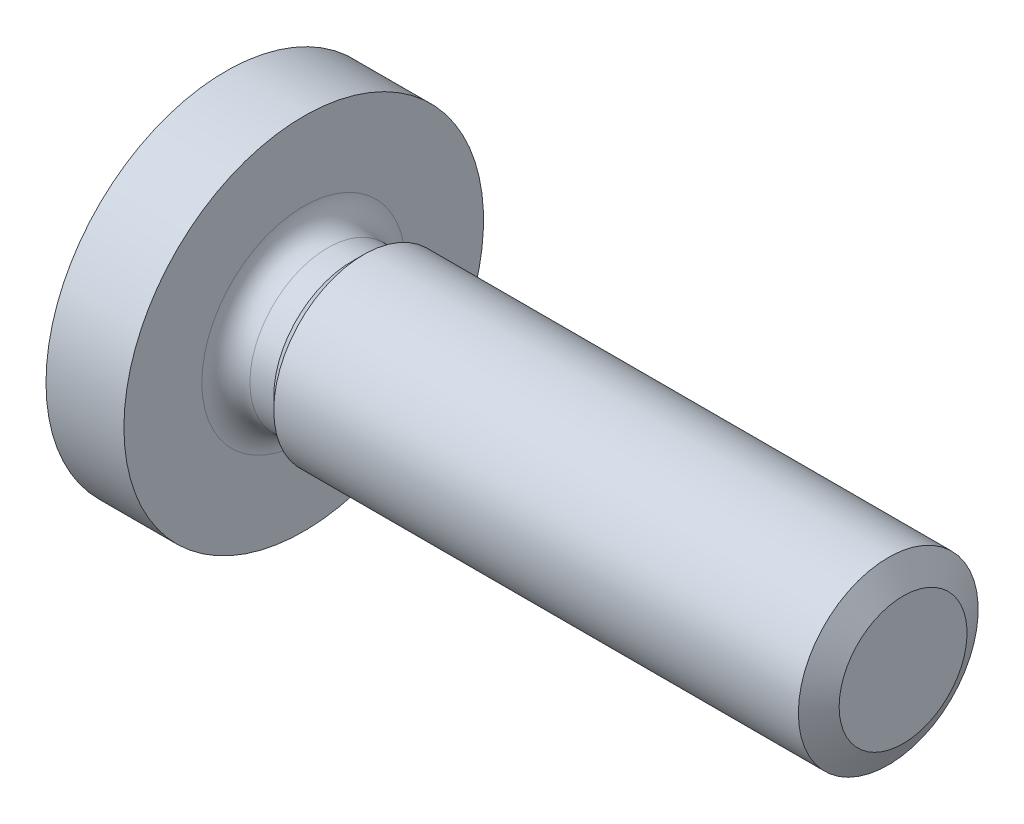
ISO-10303-21;
HEADER;
FILE_DESCRIPTION(('STEP AP214'),'2;1');
FILE_NAME('part.step','',(''),(''),'','','');
FILE_SCHEMA(('AUTOMOTIVE_DESIGN { 1 0 10303 214 1 1 1 1 }'));
ENDSEC;
DATA;
#1=APPLICATION_CONTEXT('core data for automotive mechanical design processes');
#2=APPLICATION_PROTOCOL_DEFINITION('international standard','automotive_design',2000,#1);
#3=PRODUCT_CONTEXT('',#1,'mechanical');
#4=PRODUCT('Part','Part','',(#3));
#5=PRODUCT_RELATED_PRODUCT_CATEGORY('part','',(#4));
#6=PRODUCT_DEFINITION_FORMATION('','',#4);
#7=PRODUCT_DEFINITION_CONTEXT('part definition',#1,'design');
#8=PRODUCT_DEFINITION('design','',#6,#7);
#9=PRODUCT_DEFINITION_SHAPE('','',#8);
#10=(LENGTH_UNIT() NAMED_UNIT(*) SI_UNIT(.MILLI.,.METRE.));
#11=(NAMED_UNIT(*) PLANE_ANGLE_UNIT() SI_UNIT($,.RADIAN.));
#12=(NAMED_UNIT(*) SI_UNIT($,.STERADIAN.) SOLID_ANGLE_UNIT());
#13=UNCERTAINTY_MEASURE_WITH_UNIT(LENGTH_MEASURE(1.E-05),#10,'distance_accuracy_value','');
#14=(GEOMETRIC_REPRESENTATION_CONTEXT(3) GLOBAL_UNCERTAINTY_ASSIGNED_CONTEXT((#13)) GLOBAL_UNIT_ASSIGNED_CONTEXT((#10,
#11,#12)) REPRESENTATION_CONTEXT('',''));
#15=CARTESIAN_POINT('',(0.,0.,0.));
#16=DIRECTION('',(0.,0.,1.));
#17=DIRECTION('',(1.,0.,0.));
#18=AXIS2_PLACEMENT_3D('',#15,#16,#17);
#19=CARTESIAN_POINT('',(3.6,0.,0.));
#20=DIRECTION('',(0.137568371274688,0.,-0.990492273177751));
#21=DIRECTION('',(-0.990492273177752,0.,-0.137568371274688));
#22=AXIS2_PLACEMENT_3D('',#19,#20,#21);
#23=PLANE('',#22);
#24=DIRECTION('',(-0.71838544707728,-0.688452720115727,-0.0997757565385112));
#25=VECTOR('',#24,1.);
#26=CARTESIAN_POINT('',(3.6,0.,0.));
#27=LINE('',#26,#25);
#28=CARTESIAN_POINT('',(3.6,0.,0.));
#29=VERTEX_POINT('',#28);
#30=CARTESIAN_POINT('',(0.470296179970065,-2.99929949419535,-0.434681086115269));
#31=VERTEX_POINT('',#30);
#32=EDGE_CURVE('E156',#29,#31,#27,.T.);
#33=ORIENTED_EDGE('',*,*,#32,.F.);
#34=DIRECTION('',(-0.981250680241291,-0.136284816700179,-0.136284816700179));
#35=VECTOR('',#34,1.);
#36=CARTESIAN_POINT('',(3.6,0.,0.));
#37=LINE('',#36,#35);
#38=CARTESIAN_POINT('',(0.0246887531766358,-0.496571006503243,-0.496571006503246));
#39=VERTEX_POINT('',#38);
#40=EDGE_CURVE('E117',#29,#39,#37,.T.);
#41=ORIENTED_EDGE('',*,*,#40,.T.);
#42=CARTESIAN_POINT('',(9.87887963663891,0.,0.872066616199849));
#43=DIRECTION('',(0.137568371274688,0.,-0.990492273177751));
#44=DIRECTION('',(-0.990492273177752,0.,-0.137568371274688));
#45=AXIS2_PLACEMENT_3D('',#42,#43,#44);
#46=CIRCLE('',#45,9.96116608005755);
#47=EDGE_CURVE('E130',#31,#39,#46,.T.);
#48=ORIENTED_EDGE('',*,*,#47,.F.);
#49=EDGE_LOOP('',(#33,#41,#48));
#50=FACE_BOUND('',#49,.T.);
#51=ADVANCED_FACE('F37',(#50),#23,.F.);
#52=CARTESIAN_POINT('',(3.6,0.,0.));
#53=DIRECTION('',(0.137568371274688,0.,0.990492273177751));
#54=DIRECTION('',(0.990492273177752,0.,-0.137568371274688));
#55=AXIS2_PLACEMENT_3D('',#52,#53,#54);
#56=PLANE('',#55);
#57=CARTESIAN_POINT('',(9.87887963663891,0.,-0.872066616199848));
#58=DIRECTION('',(0.137568371274688,0.,0.990492273177751));
#59=DIRECTION('',(0.990492273177752,0.,-0.137568371274688));
#60=AXIS2_PLACEMENT_3D('',#57,#58,#59);
#61=CIRCLE('',#60,9.96116608005755);
#62=CARTESIAN_POINT('',(0.0246887531766358,-0.496571006503248,0.496571006503245));
#63=VERTEX_POINT('',#62);
#64=CARTESIAN_POINT('',(0.470296179970068,-2.99929949419536,0.434681086115269));
#65=VERTEX_POINT('',#64);
#66=EDGE_CURVE('E60',#63,#65,#61,.T.);
#67=ORIENTED_EDGE('',*,*,#66,.F.);
#68=DIRECTION('',(0.981250680241291,0.13628481670018,-0.136284816700179));
#69=VECTOR('',#68,1.);
#70=CARTESIAN_POINT('',(3.6,0.,0.));
#71=LINE('',#70,#69);
#72=EDGE_CURVE('E11',#63,#29,#71,.T.);
#73=ORIENTED_EDGE('',*,*,#72,.T.);
#74=DIRECTION('',(-0.71838544707728,-0.688452720115727,0.0997757565385112));
#75=VECTOR('',#74,1.);
#76=CARTESIAN_POINT('',(3.6,0.,0.));
#77=LINE('',#76,#75);
#78=EDGE_CURVE('E157',#29,#65,#77,.T.);
#79=ORIENTED_EDGE('',*,*,#78,.T.);
#80=EDGE_LOOP('',(#67,#73,#79));
#81=FACE_BOUND('',#80,.T.);
#82=ADVANCED_FACE('F172',(#81),#56,.F.);
#83=CARTESIAN_POINT('',(-1.33175770411172,0.,0.));
#84=DIRECTION('',(-1.,0.,0.));
#85=DIRECTION('',(0.,0.,1.));
#86=AXIS2_PLACEMENT_3D('',#83,#84,#85);
#87=CYLINDRICAL_SURFACE('',#86,3.);
#88=CARTESIAN_POINT('',(6.6,0.,0.));
#89=DIRECTION('',(-1.,0.,0.));
#90=DIRECTION('',(0.,0.,1.));
#91=AXIS2_PLACEMENT_3D('',#88,#89,#90);
#92=CIRCLE('',#91,3.);
#93=CARTESIAN_POINT('',(6.6,0.,3.));
#94=VERTEX_POINT('',#93);
#95=EDGE_CURVE('E193',#94,#94,#92,.T.);
#96=ORIENTED_EDGE('',*,*,#95,.F.);
#97=EDGE_LOOP('',(#96));
#98=FACE_BOUND('',#97,.T.);
#99=CARTESIAN_POINT('',(24.1054160057443,0.,0.));
#100=DIRECTION('',(-1.,0.,0.));
#101=DIRECTION('',(0.,0.,1.));
#102=AXIS2_PLACEMENT_3D('',#99,#100,#101);
#103=CIRCLE('',#102,3.);
#104=CARTESIAN_POINT('',(24.1054160057443,0.,3.));
#105=VERTEX_POINT('',#104);
#106=EDGE_CURVE('E190',#105,#105,#103,.T.);
#107=ORIENTED_EDGE('',*,*,#106,.T.);
#108=EDGE_LOOP('',(#107));
#109=FACE_BOUND('',#108,.T.);
#110=ADVANCED_FACE('F237',(#98,#109),#87,.T.);
#111=CARTESIAN_POINT('',(10.,0.,0.));
#112=DIRECTION('',(-1.,0.,0.));
#113=DIRECTION('',(0.,1.,0.));
#114=AXIS2_PLACEMENT_3D('',#111,#112,#113);
#115=SPHERICAL_SURFACE('',#114,10.);
#116=CARTESIAN_POINT('',(6.93610859728507,0.,-3.19710407239819));
#117=DIRECTION('',(0.691905363235615,0.,0.721988205115424));
#118=DIRECTION('',(0.721988205115424,0.,-0.691905363235615));
#119=AXIS2_PLACEMENT_3D('',#116,#117,#118);
#120=CIRCLE('',#119,8.96610813132568);
#121=CARTESIAN_POINT('',(0.470296179970068,0.434681086115258,2.99929949419536));
#122=VERTEX_POINT('',#121);
#123=CARTESIAN_POINT('',(0.470296179970064,-0.434681086115279,2.99929949419535));
#124=VERTEX_POINT('',#123);
#125=EDGE_CURVE('E123',#122,#124,#120,.T.);
#126=ORIENTED_EDGE('',*,*,#125,.T.);
#127=CARTESIAN_POINT('',(9.87887963663891,0.872066616199849,0.));
#128=DIRECTION('',(0.137568371274688,-0.990492273177751,0.));
#129=DIRECTION('',(0.990492273177752,0.137568371274688,0.));
#130=AXIS2_PLACEMENT_3D('',#127,#128,#129);
#131=CIRCLE('',#130,9.96116608005755);
#132=EDGE_CURVE('E139',#124,#63,#131,.T.);
#133=ORIENTED_EDGE('',*,*,#132,.T.);
#134=ORIENTED_EDGE('',*,*,#66,.T.);
#135=CARTESIAN_POINT('',(6.93610859728507,3.19710407239819,0.));
#136=DIRECTION('',(0.691905363235615,-0.721988205115424,0.));
#137=DIRECTION('',(0.721988205115424,0.691905363235615,0.));
#138=AXIS2_PLACEMENT_3D('',#135,#136,#137);
#139=CIRCLE('',#138,8.96610813132568);
#140=EDGE_CURVE('E169',#65,#31,#139,.T.);
#141=ORIENTED_EDGE('',*,*,#140,.T.);
#142=ORIENTED_EDGE('',*,*,#47,.T.);
#143=CARTESIAN_POINT('',(0.470296179970064,-0.434681086115258,-2.99929949419535));
#144=VERTEX_POINT('',#143);
#145=EDGE_CURVE('E119',#39,#144,#131,.T.);
#146=ORIENTED_EDGE('',*,*,#145,.T.);
#147=CARTESIAN_POINT('',(6.93610859728507,0.,3.19710407239819));
#148=DIRECTION('',(0.691905363235615,0.,-0.721988205115424));
#149=DIRECTION('',(-0.721988205115424,0.,-0.691905363235615));
#150=AXIS2_PLACEMENT_3D('',#147,#148,#149);
#151=CIRCLE('',#150,8.96610813132568);
#152=CARTESIAN_POINT('',(0.470296179970066,0.434681086115279,-2.99929949419535));
#153=VERTEX_POINT('',#152);
#154=EDGE_CURVE('E111',#144,#153,#151,.T.);
#155=ORIENTED_EDGE('',*,*,#154,.T.);
#156=CARTESIAN_POINT('',(9.87887963663891,-0.872066616199848,0.));
#157=DIRECTION('',(0.137568371274688,0.990492273177751,0.));
#158=DIRECTION('',(-0.990492273177752,0.137568371274688,0.));
#159=AXIS2_PLACEMENT_3D('',#156,#157,#158);
#160=CIRCLE('',#159,9.96116608005755);
#161=CARTESIAN_POINT('',(0.024688753176634,0.496571006503247,-0.496571006503246));
#162=VERTEX_POINT('',#161);
#163=EDGE_CURVE('E102',#153,#162,#160,.T.);
#164=ORIENTED_EDGE('',*,*,#163,.T.);
#165=CARTESIAN_POINT('',(0.470296179970065,2.99929949419535,-0.434681086115269));
#166=VERTEX_POINT('',#165);
#167=EDGE_CURVE('E147',#162,#166,#46,.T.);
#168=ORIENTED_EDGE('',*,*,#167,.T.);
#169=CARTESIAN_POINT('',(6.93610859728507,-3.19710407239819,0.));
#170=DIRECTION('',(0.691905363235615,0.721988205115424,0.));
#171=DIRECTION('',(-0.721988205115424,0.691905363235615,0.));
#172=AXIS2_PLACEMENT_3D('',#169,#170,#171);
#173=CIRCLE('',#172,8.96610813132568);
#174=CARTESIAN_POINT('',(0.470296179970068,2.99929949419536,0.434681086115269));
#175=VERTEX_POINT('',#174);
#176=EDGE_CURVE('E160',#166,#175,#173,.T.);
#177=ORIENTED_EDGE('',*,*,#176,.T.);
#178=CARTESIAN_POINT('',(0.0246887531766358,0.496571006503243,0.496571006503246));
#179=VERTEX_POINT('',#178);
#180=EDGE_CURVE('E152',#175,#179,#61,.T.);
#181=ORIENTED_EDGE('',*,*,#180,.T.);
#182=EDGE_CURVE('E52',#179,#122,#160,.T.);
#183=ORIENTED_EDGE('',*,*,#182,.T.);
#184=EDGE_LOOP('',(#126,#133,#134,#141,#142,#146,#155,#164,#168,#177,#181,#183));
#185=FACE_BOUND('',#184,.T.);
#186=CARTESIAN_POINT('',(2.,0.,0.));
#187=DIRECTION('',(-1.,0.,0.));
#188=DIRECTION('',(0.,0.,1.));
#189=AXIS2_PLACEMENT_3D('',#186,#187,#188);
#190=CIRCLE('',#189,6.);
#191=CARTESIAN_POINT('',(2.,0.,6.));
#192=VERTEX_POINT('',#191);
#193=EDGE_CURVE('E173',#192,#192,#190,.T.);
#194=ORIENTED_EDGE('',*,*,#193,.T.);
#195=EDGE_LOOP('',(#194));
#196=FACE_BOUND('',#195,.T.);
#197=ADVANCED_FACE('F39',(#185,#196),#115,.T.);
#198=CARTESIAN_POINT('',(-1.33175770411172,0.,0.));
#199=DIRECTION('',(-1.,0.,0.));
#200=DIRECTION('',(0.,0.,1.));
#201=AXIS2_PLACEMENT_3D('',#198,#199,#200);
#202=CYLINDRICAL_SURFACE('',#201,6.);
#203=ORIENTED_EDGE('',*,*,#193,.F.);
#204=EDGE_LOOP('',(#203));
#205=FACE_BOUND('',#204,.T.);
#206=CARTESIAN_POINT('',(4.6,0.,0.));
#207=DIRECTION('',(-1.,0.,0.));
#208=DIRECTION('',(0.,0.,1.));
#209=AXIS2_PLACEMENT_3D('',#206,#207,#208);
#210=CIRCLE('',#209,6.);
#211=CARTESIAN_POINT('',(4.6,0.,6.));
#212=VERTEX_POINT('',#211);
#213=EDGE_CURVE('E176',#212,#212,#210,.T.);
#214=ORIENTED_EDGE('',*,*,#213,.T.);
#215=EDGE_LOOP('',(#214));
#216=FACE_BOUND('',#215,.T.);
#217=ADVANCED_FACE('F210',(#205,#216),#202,.T.);
#218=CARTESIAN_POINT('',(4.6,3.4,0.));
#219=DIRECTION('',(-1.,0.,0.));
#220=DIRECTION('',(0.,0.,1.));
#221=AXIS2_PLACEMENT_3D('',#218,#219,#220);
#222=PLANE('',#221);
#223=ORIENTED_EDGE('',*,*,#213,.F.);
#224=EDGE_LOOP('',(#223));
#225=FACE_BOUND('',#224,.T.);
#226=CARTESIAN_POINT('',(4.6,0.,0.));
#227=DIRECTION('',(-1.,0.,0.));
#228=DIRECTION('',(0.,0.,1.));
#229=AXIS2_PLACEMENT_3D('',#226,#227,#228);
#230=CIRCLE('',#229,3.4);
#231=CARTESIAN_POINT('',(4.6,0.,3.4));
#232=VERTEX_POINT('',#231);
#233=EDGE_CURVE('E202',#232,#232,#230,.T.);
#234=ORIENTED_EDGE('',*,*,#233,.T.);
#235=EDGE_LOOP('',(#234));
#236=FACE_BOUND('',#235,.T.);
#237=ADVANCED_FACE('F212',(#225,#236),#222,.F.);
#238=CARTESIAN_POINT('',(5.402,0.,0.));
#239=DIRECTION('',(-1.,0.,0.));
#240=DIRECTION('',(0.,0.,1.));
#241=AXIS2_PLACEMENT_3D('',#238,#239,#240);
#242=TOROIDAL_SURFACE('',#241,3.4,0.801999999999999);
#243=ORIENTED_EDGE('',*,*,#233,.F.);
#244=EDGE_LOOP('',(#243));
#245=FACE_BOUND('',#244,.T.);
#246=CARTESIAN_POINT('',(5.402,0.,0.));
#247=DIRECTION('',(-1.,0.,0.));
#248=DIRECTION('',(0.,0.,1.));
#249=AXIS2_PLACEMENT_3D('',#246,#247,#248);
#250=CIRCLE('',#249,2.598);
#251=CARTESIAN_POINT('',(5.402,0.,2.598));
#252=VERTEX_POINT('',#251);
#253=EDGE_CURVE('E199',#252,#252,#250,.T.);
#254=ORIENTED_EDGE('',*,*,#253,.T.);
#255=EDGE_LOOP('',(#254));
#256=FACE_BOUND('',#255,.T.);
#257=ADVANCED_FACE('F215',(#245,#256),#242,.F.);
#258=CARTESIAN_POINT('',(-1.33175770411172,0.,0.));
#259=DIRECTION('',(-1.,0.,0.));
#260=DIRECTION('',(0.,0.,1.));
#261=AXIS2_PLACEMENT_3D('',#258,#259,#260);
#262=CYLINDRICAL_SURFACE('',#261,2.598);
#263=ORIENTED_EDGE('',*,*,#253,.F.);
#264=EDGE_LOOP('',(#263));
#265=FACE_BOUND('',#264,.T.);
#266=CARTESIAN_POINT('',(6.198,0.,0.));
#267=DIRECTION('',(-1.,0.,0.));
#268=DIRECTION('',(0.,0.,1.));
#269=AXIS2_PLACEMENT_3D('',#266,#267,#268);
#270=CIRCLE('',#269,2.598);
#271=CARTESIAN_POINT('',(6.198,0.,2.598));
#272=VERTEX_POINT('',#271);
#273=EDGE_CURVE('E196',#272,#272,#270,.T.);
#274=ORIENTED_EDGE('',*,*,#273,.T.);
#275=EDGE_LOOP('',(#274));
#276=FACE_BOUND('',#275,.T.);
#277=ADVANCED_FACE('F221',(#265,#276),#262,.T.);
#278=CARTESIAN_POINT('',(6.6,0.,0.));
#279=DIRECTION('',(1.,0.,0.));
#280=DIRECTION('',(0.,0.,-1.));
#281=AXIS2_PLACEMENT_3D('',#278,#279,#280);
#282=CONICAL_SURFACE('',#281,3.,0.785398163397445);
#283=ORIENTED_EDGE('',*,*,#273,.F.);
#284=EDGE_LOOP('',(#283));
#285=FACE_BOUND('',#284,.T.);
#286=ORIENTED_EDGE('',*,*,#95,.T.);
#287=EDGE_LOOP('',(#286));
#288=FACE_BOUND('',#287,.T.);
#289=ADVANCED_FACE('F227',(#285,#288),#282,.T.);
#290=CARTESIAN_POINT('',(24.1054160057443,0.,0.));
#291=DIRECTION('',(-1.,0.,0.));
#292=DIRECTION('',(0.,0.,1.));
#293=AXIS2_PLACEMENT_3D('',#290,#291,#292);
#294=CONICAL_SURFACE('',#293,3.,1.05188801855298);
#295=CARTESIAN_POINT('',(24.6,0.,0.));
#296=DIRECTION('',(-1.,0.,0.));
#297=DIRECTION('',(0.,0.,1.));
#298=AXIS2_PLACEMENT_3D('',#295,#296,#297);
#299=CIRCLE('',#298,2.134);
#300=CARTESIAN_POINT('',(24.6,0.,2.134));
#301=VERTEX_POINT('',#300);
#302=EDGE_CURVE('E161',#301,#301,#299,.T.);
#303=ORIENTED_EDGE('',*,*,#302,.T.);
#304=EDGE_LOOP('',(#303));
#305=FACE_BOUND('',#304,.T.);
#306=ORIENTED_EDGE('',*,*,#106,.F.);
#307=EDGE_LOOP('',(#306));
#308=FACE_BOUND('',#307,.T.);
#309=ADVANCED_FACE('F233',(#305,#308),#294,.T.);
#310=CARTESIAN_POINT('',(24.6,0.,0.));
#311=DIRECTION('',(-1.,0.,0.));
#312=DIRECTION('',(0.,0.,1.));
#313=AXIS2_PLACEMENT_3D('',#310,#311,#312);
#314=PLANE('',#313);
#315=ORIENTED_EDGE('',*,*,#302,.F.);
#316=EDGE_LOOP('',(#315));
#317=FACE_BOUND('',#316,.T.);
#318=ADVANCED_FACE('F244',(#317),#314,.F.);
#319=ORIENTED_EDGE('',*,*,#167,.F.);
#320=DIRECTION('',(0.981250680241291,-0.13628481670018,0.136284816700179));
#321=VECTOR('',#320,1.);
#322=CARTESIAN_POINT('',(3.6,0.,0.));
#323=LINE('',#322,#321);
#324=EDGE_CURVE('E100',#162,#29,#323,.T.);
#325=ORIENTED_EDGE('',*,*,#324,.T.);
#326=DIRECTION('',(-0.71838544707728,0.688452720115727,-0.0997757565385112));
#327=VECTOR('',#326,1.);
#328=CARTESIAN_POINT('',(3.6,0.,0.));
#329=LINE('',#328,#327);
#330=EDGE_CURVE('E146',#29,#166,#329,.T.);
#331=ORIENTED_EDGE('',*,*,#330,.T.);
#332=EDGE_LOOP('',(#319,#325,#331));
#333=FACE_BOUND('',#332,.T.);
#334=ADVANCED_FACE('F144',(#333),#23,.F.);
#335=CARTESIAN_POINT('',(0.,3.45,-0.5));
#336=DIRECTION('',(0.691905363235615,0.721988205115424,0.));
#337=DIRECTION('',(-0.721988205115424,0.691905363235615,0.));
#338=AXIS2_PLACEMENT_3D('',#335,#336,#337);
#339=PLANE('',#338);
#340=ORIENTED_EDGE('',*,*,#330,.F.);
#341=DIRECTION('',(-0.71838544707728,0.688452720115727,0.0997757565385111));
#342=VECTOR('',#341,1.);
#343=CARTESIAN_POINT('',(3.6,0.,0.));
#344=LINE('',#343,#342);
#345=EDGE_CURVE('E150',#29,#175,#344,.T.);
#346=ORIENTED_EDGE('',*,*,#345,.T.);
#347=ORIENTED_EDGE('',*,*,#176,.F.);
#348=EDGE_LOOP('',(#340,#346,#347));
#349=FACE_BOUND('',#348,.T.);
#350=ADVANCED_FACE('F159',(#349),#339,.F.);
#351=CARTESIAN_POINT('',(0.,-3.45,0.5));
#352=DIRECTION('',(0.691905363235615,-0.721988205115424,0.));
#353=DIRECTION('',(0.721988205115424,0.691905363235615,0.));
#354=AXIS2_PLACEMENT_3D('',#351,#352,#353);
#355=PLANE('',#354);
#356=ORIENTED_EDGE('',*,*,#78,.F.);
#357=ORIENTED_EDGE('',*,*,#32,.T.);
#358=ORIENTED_EDGE('',*,*,#140,.F.);
#359=EDGE_LOOP('',(#356,#357,#358));
#360=FACE_BOUND('',#359,.T.);
#361=ADVANCED_FACE('F168',(#360),#355,.F.);
#362=ORIENTED_EDGE('',*,*,#345,.F.);
#363=DIRECTION('',(-0.981250680241291,0.136284816700179,0.136284816700179));
#364=VECTOR('',#363,1.);
#365=CARTESIAN_POINT('',(3.6,0.,0.));
#366=LINE('',#365,#364);
#367=EDGE_CURVE('E45',#29,#179,#366,.T.);
#368=ORIENTED_EDGE('',*,*,#367,.T.);
#369=ORIENTED_EDGE('',*,*,#180,.F.);
#370=EDGE_LOOP('',(#362,#368,#369));
#371=FACE_BOUND('',#370,.T.);
#372=ADVANCED_FACE('F151',(#371),#56,.F.);
#373=CARTESIAN_POINT('',(3.6,0.,0.));
#374=DIRECTION('',(0.137568371274688,-0.990492273177751,0.));
#375=DIRECTION('',(-0.990492273177752,-0.137568371274688,0.));
#376=AXIS2_PLACEMENT_3D('',#373,#374,#375);
#377=PLANE('',#376);
#378=DIRECTION('',(-0.71838544707728,-0.0997757565385136,0.688452720115727));
#379=VECTOR('',#378,1.);
#380=CARTESIAN_POINT('',(3.6,0.,0.));
#381=LINE('',#380,#379);
#382=EDGE_CURVE('E114',#29,#124,#381,.T.);
#383=ORIENTED_EDGE('',*,*,#382,.F.);
#384=ORIENTED_EDGE('',*,*,#72,.F.);
#385=ORIENTED_EDGE('',*,*,#132,.F.);
#386=EDGE_LOOP('',(#383,#384,#385));
#387=FACE_BOUND('',#386,.T.);
#388=ADVANCED_FACE('F138',(#387),#377,.F.);
#389=CARTESIAN_POINT('',(3.6,0.,0.));
#390=DIRECTION('',(0.137568371274688,0.990492273177751,0.));
#391=DIRECTION('',(0.990492273177752,-0.137568371274688,0.));
#392=AXIS2_PLACEMENT_3D('',#389,#390,#391);
#393=PLANE('',#392);
#394=ORIENTED_EDGE('',*,*,#367,.F.);
#395=DIRECTION('',(-0.71838544707728,0.0997757565385087,0.688452720115727));
#396=VECTOR('',#395,1.);
#397=CARTESIAN_POINT('',(3.6,0.,0.));
#398=LINE('',#397,#396);
#399=EDGE_CURVE('E105',#29,#122,#398,.T.);
#400=ORIENTED_EDGE('',*,*,#399,.T.);
#401=ORIENTED_EDGE('',*,*,#182,.F.);
#402=EDGE_LOOP('',(#394,#400,#401));
#403=FACE_BOUND('',#402,.T.);
#404=ADVANCED_FACE('F126',(#403),#393,.F.);
#405=CARTESIAN_POINT('',(0.,-0.500000000000012,3.45));
#406=DIRECTION('',(0.691905363235615,0.,0.721988205115424));
#407=DIRECTION('',(-0.721988205115424,0.,0.691905363235615));
#408=AXIS2_PLACEMENT_3D('',#405,#406,#407);
#409=PLANE('',#408);
#410=ORIENTED_EDGE('',*,*,#399,.F.);
#411=ORIENTED_EDGE('',*,*,#382,.T.);
#412=ORIENTED_EDGE('',*,*,#125,.F.);
#413=EDGE_LOOP('',(#410,#411,#412));
#414=FACE_BOUND('',#413,.T.);
#415=ADVANCED_FACE('F134',(#414),#409,.F.);
#416=ORIENTED_EDGE('',*,*,#40,.F.);
#417=DIRECTION('',(-0.71838544707728,-0.0997757565385088,-0.688452720115727));
#418=VECTOR('',#417,1.);
#419=CARTESIAN_POINT('',(3.6,0.,0.));
#420=LINE('',#419,#418);
#421=EDGE_CURVE('E108',#29,#144,#420,.T.);
#422=ORIENTED_EDGE('',*,*,#421,.T.);
#423=ORIENTED_EDGE('',*,*,#145,.F.);
#424=EDGE_LOOP('',(#416,#422,#423));
#425=FACE_BOUND('',#424,.T.);
#426=ADVANCED_FACE('F118',(#425),#377,.F.);
#427=CARTESIAN_POINT('',(0.,0.500000000000012,-3.45));
#428=DIRECTION('',(0.691905363235615,0.,-0.721988205115424));
#429=DIRECTION('',(0.721988205115424,0.,0.691905363235615));
#430=AXIS2_PLACEMENT_3D('',#427,#428,#429);
#431=PLANE('',#430);
#432=ORIENTED_EDGE('',*,*,#421,.F.);
#433=DIRECTION('',(-0.71838544707728,0.0997757565385136,-0.688452720115727));
#434=VECTOR('',#433,1.);
#435=CARTESIAN_POINT('',(3.6,0.,0.));
#436=LINE('',#435,#434);
#437=EDGE_CURVE('E96',#29,#153,#436,.T.);
#438=ORIENTED_EDGE('',*,*,#437,.T.);
#439=ORIENTED_EDGE('',*,*,#154,.F.);
#440=EDGE_LOOP('',(#432,#438,#439));
#441=FACE_BOUND('',#440,.T.);
#442=ADVANCED_FACE('F110',(#441),#431,.F.);
#443=ORIENTED_EDGE('',*,*,#437,.F.);
#444=ORIENTED_EDGE('',*,*,#324,.F.);
#445=ORIENTED_EDGE('',*,*,#163,.F.);
#446=EDGE_LOOP('',(#443,#444,#445));
#447=FACE_BOUND('',#446,.T.);
#448=ADVANCED_FACE('F98',(#447),#393,.F.);
#449=CLOSED_SHELL('',(#51,#82,#110,#197,#217,#237,#257,#277,#289,#309,#318,#334,#350,#361,#372,
#388,#404,#415,#426,#442,#448));
#450=MANIFOLD_SOLID_BREP('B2',#449);
#451=ADVANCED_BREP_SHAPE_REPRESENTATION('',(#18,#450),#14);
#452=SHAPE_DEFINITION_REPRESENTATION(#9,#451);
ENDSEC;
END-ISO-10303-21;
